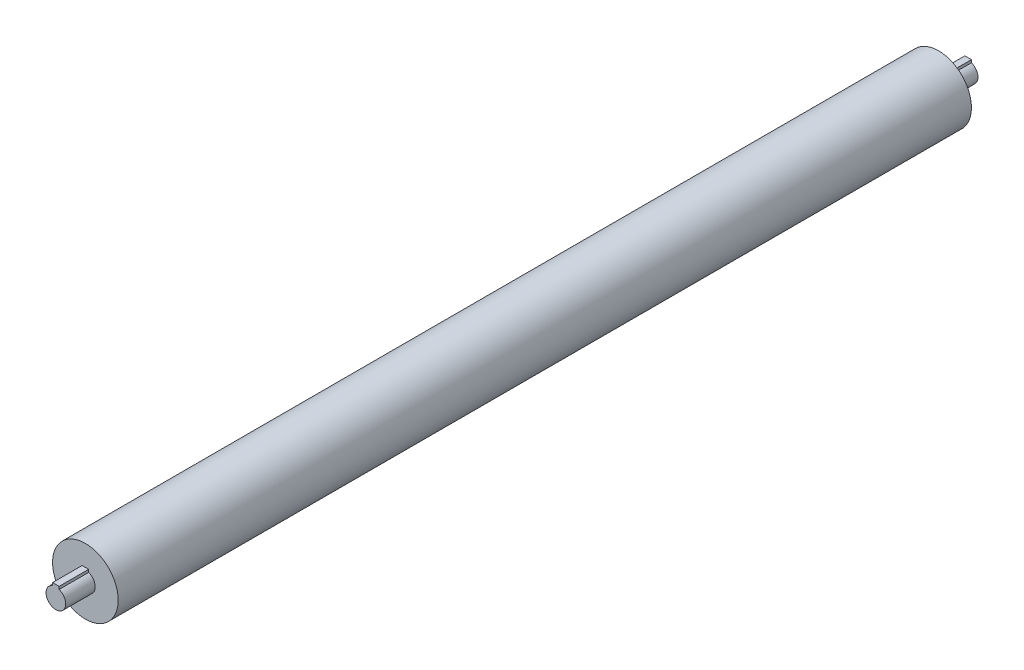
ISO-10303-21;
HEADER;
FILE_DESCRIPTION(('STEP AP214'),'2;1');
FILE_NAME('part.step','',(''),(''),'','','');
FILE_SCHEMA(('AUTOMOTIVE_DESIGN { 1 0 10303 214 1 1 1 1 }'));
ENDSEC;
DATA;
#1=APPLICATION_CONTEXT('core data for automotive mechanical design processes');
#2=APPLICATION_PROTOCOL_DEFINITION('international standard','automotive_design',2000,#1);
#3=PRODUCT_CONTEXT('',#1,'mechanical');
#4=PRODUCT('Part','Part','',(#3));
#5=PRODUCT_RELATED_PRODUCT_CATEGORY('part','',(#4));
#6=PRODUCT_DEFINITION_FORMATION('','',#4);
#7=PRODUCT_DEFINITION_CONTEXT('part definition',#1,'design');
#8=PRODUCT_DEFINITION('design','',#6,#7);
#9=PRODUCT_DEFINITION_SHAPE('','',#8);
#10=(LENGTH_UNIT() NAMED_UNIT(*) SI_UNIT(.MILLI.,.METRE.));
#11=(NAMED_UNIT(*) PLANE_ANGLE_UNIT() SI_UNIT($,.RADIAN.));
#12=(NAMED_UNIT(*) SI_UNIT($,.STERADIAN.) SOLID_ANGLE_UNIT());
#13=UNCERTAINTY_MEASURE_WITH_UNIT(LENGTH_MEASURE(1.E-05),#10,'distance_accuracy_value','');
#14=(GEOMETRIC_REPRESENTATION_CONTEXT(3) GLOBAL_UNCERTAINTY_ASSIGNED_CONTEXT((#13)) GLOBAL_UNIT_ASSIGNED_CONTEXT((#10,
#11,#12)) REPRESENTATION_CONTEXT('',''));
#15=CARTESIAN_POINT('',(0.,0.,0.));
#16=DIRECTION('',(0.,0.,1.));
#17=DIRECTION('',(1.,0.,0.));
#18=AXIS2_PLACEMENT_3D('',#15,#16,#17);
#19=CARTESIAN_POINT('',(0.,0.,650.));
#20=DIRECTION('',(0.,0.,-1.));
#21=DIRECTION('',(-1.,0.,0.));
#22=AXIS2_PLACEMENT_3D('',#19,#20,#21);
#23=CYLINDRICAL_SURFACE('',#22,50.);
#24=CARTESIAN_POINT('',(0.,0.,650.));
#25=DIRECTION('',(0.,0.,1.));
#26=DIRECTION('',(1.,0.,0.));
#27=AXIS2_PLACEMENT_3D('',#24,#25,#26);
#28=CIRCLE('',#27,50.);
#29=CARTESIAN_POINT('',(50.,0.,650.));
#30=VERTEX_POINT('',#29);
#31=EDGE_CURVE('E155',#30,#30,#28,.T.);
#32=ORIENTED_EDGE('',*,*,#31,.F.);
#33=EDGE_LOOP('',(#32));
#34=FACE_BOUND('',#33,.T.);
#35=CARTESIAN_POINT('',(0.,0.,-650.));
#36=DIRECTION('',(0.,0.,1.));
#37=DIRECTION('',(1.,0.,0.));
#38=AXIS2_PLACEMENT_3D('',#35,#36,#37);
#39=CIRCLE('',#38,50.);
#40=CARTESIAN_POINT('',(50.,0.,-650.));
#41=VERTEX_POINT('',#40);
#42=EDGE_CURVE('E154',#41,#41,#39,.T.);
#43=ORIENTED_EDGE('',*,*,#42,.T.);
#44=EDGE_LOOP('',(#43));
#45=FACE_BOUND('',#44,.T.);
#46=ADVANCED_FACE('F37',(#34,#45),#23,.T.);
#47=CARTESIAN_POINT('',(0.,0.,650.));
#48=DIRECTION('',(0.,0.,1.));
#49=DIRECTION('',(1.,0.,0.));
#50=AXIS2_PLACEMENT_3D('',#47,#48,#49);
#51=PLANE('',#50);
#52=DIRECTION('',(0.,-1.,0.));
#53=VECTOR('',#52,1.);
#54=CARTESIAN_POINT('',(-5.,0.,650.));
#55=LINE('',#54,#53);
#56=CARTESIAN_POINT('',(-5.,18.3,650.));
#57=VERTEX_POINT('',#56);
#58=CARTESIAN_POINT('',(-5.,14.1421356237309,650.));
#59=VERTEX_POINT('',#58);
#60=EDGE_CURVE('E106',#57,#59,#55,.T.);
#61=ORIENTED_EDGE('',*,*,#60,.F.);
#62=DIRECTION('',(-1.,0.,0.));
#63=VECTOR('',#62,1.);
#64=CARTESIAN_POINT('',(0.,18.3,650.));
#65=LINE('',#64,#63);
#66=CARTESIAN_POINT('',(5.,18.3,650.));
#67=VERTEX_POINT('',#66);
#68=EDGE_CURVE('E108',#67,#57,#65,.T.);
#69=ORIENTED_EDGE('',*,*,#68,.F.);
#70=DIRECTION('',(0.,1.,0.));
#71=VECTOR('',#70,1.);
#72=CARTESIAN_POINT('',(5.,0.,650.));
#73=LINE('',#72,#71);
#74=CARTESIAN_POINT('',(5.,14.1421356237309,650.));
#75=VERTEX_POINT('',#74);
#76=EDGE_CURVE('E56',#75,#67,#73,.T.);
#77=ORIENTED_EDGE('',*,*,#76,.F.);
#78=CARTESIAN_POINT('',(0.,0.,650.));
#79=DIRECTION('',(0.,0.,1.));
#80=DIRECTION('',(1.,0.,0.));
#81=AXIS2_PLACEMENT_3D('',#78,#79,#80);
#82=CIRCLE('',#81,15.);
#83=EDGE_CURVE('E51',#75,#59,#82,.F.);
#84=ORIENTED_EDGE('',*,*,#83,.T.);
#85=EDGE_LOOP('',(#61,#69,#77,#84));
#86=FACE_BOUND('',#85,.T.);
#87=ORIENTED_EDGE('',*,*,#31,.T.);
#88=EDGE_LOOP('',(#87));
#89=FACE_BOUND('',#88,.T.);
#90=ADVANCED_FACE('F195',(#86,#89),#51,.T.);
#91=CARTESIAN_POINT('',(0.,0.,-650.));
#92=DIRECTION('',(0.,0.,1.));
#93=DIRECTION('',(1.,0.,0.));
#94=AXIS2_PLACEMENT_3D('',#91,#92,#93);
#95=PLANE('',#94);
#96=DIRECTION('',(-1.,0.,0.));
#97=VECTOR('',#96,1.);
#98=CARTESIAN_POINT('',(0.,18.3,-650.));
#99=LINE('',#98,#97);
#100=CARTESIAN_POINT('',(5.,18.3,-650.));
#101=VERTEX_POINT('',#100);
#102=CARTESIAN_POINT('',(-5.,18.3,-650.));
#103=VERTEX_POINT('',#102);
#104=EDGE_CURVE('E158',#101,#103,#99,.T.);
#105=ORIENTED_EDGE('',*,*,#104,.T.);
#106=DIRECTION('',(0.,-1.,0.));
#107=VECTOR('',#106,1.);
#108=CARTESIAN_POINT('',(-5.,0.,-650.));
#109=LINE('',#108,#107);
#110=CARTESIAN_POINT('',(-5.,14.1421356237309,-650.));
#111=VERTEX_POINT('',#110);
#112=EDGE_CURVE('E11',#103,#111,#109,.T.);
#113=ORIENTED_EDGE('',*,*,#112,.T.);
#114=CARTESIAN_POINT('',(0.,0.,-650.));
#115=DIRECTION('',(0.,0.,1.));
#116=DIRECTION('',(1.,0.,0.));
#117=AXIS2_PLACEMENT_3D('',#114,#115,#116);
#118=CIRCLE('',#117,15.);
#119=CARTESIAN_POINT('',(5.,14.1421356237309,-650.));
#120=VERTEX_POINT('',#119);
#121=EDGE_CURVE('E44',#120,#111,#118,.F.);
#122=ORIENTED_EDGE('',*,*,#121,.F.);
#123=DIRECTION('',(0.,1.,0.));
#124=VECTOR('',#123,1.);
#125=CARTESIAN_POINT('',(5.,0.,-650.));
#126=LINE('',#125,#124);
#127=EDGE_CURVE('E163',#120,#101,#126,.T.);
#128=ORIENTED_EDGE('',*,*,#127,.T.);
#129=EDGE_LOOP('',(#105,#113,#122,#128));
#130=FACE_BOUND('',#129,.T.);
#131=ORIENTED_EDGE('',*,*,#42,.F.);
#132=EDGE_LOOP('',(#131));
#133=FACE_BOUND('',#132,.T.);
#134=ADVANCED_FACE('F176',(#130,#133),#95,.F.);
#135=CARTESIAN_POINT('',(0.,0.,-695.));
#136=DIRECTION('',(0.,0.,1.));
#137=DIRECTION('',(1.,0.,0.));
#138=AXIS2_PLACEMENT_3D('',#135,#136,#137);
#139=PLANE('',#138);
#140=DIRECTION('',(0.,1.,0.));
#141=VECTOR('',#140,1.);
#142=CARTESIAN_POINT('',(-5.,0.,-695.));
#143=LINE('',#142,#141);
#144=CARTESIAN_POINT('',(-5.,14.1421356237309,-695.));
#145=VERTEX_POINT('',#144);
#146=CARTESIAN_POINT('',(-5.,18.3,-695.));
#147=VERTEX_POINT('',#146);
#148=EDGE_CURVE('E133',#145,#147,#143,.T.);
#149=ORIENTED_EDGE('',*,*,#148,.T.);
#150=DIRECTION('',(1.,0.,0.));
#151=VECTOR('',#150,1.);
#152=CARTESIAN_POINT('',(0.,18.3,-695.));
#153=LINE('',#152,#151);
#154=CARTESIAN_POINT('',(5.,18.3,-695.));
#155=VERTEX_POINT('',#154);
#156=EDGE_CURVE('E124',#147,#155,#153,.T.);
#157=ORIENTED_EDGE('',*,*,#156,.T.);
#158=DIRECTION('',(0.,-1.,0.));
#159=VECTOR('',#158,1.);
#160=CARTESIAN_POINT('',(5.,0.,-695.));
#161=LINE('',#160,#159);
#162=CARTESIAN_POINT('',(5.,14.1421356237309,-695.));
#163=VERTEX_POINT('',#162);
#164=EDGE_CURVE('E127',#155,#163,#161,.T.);
#165=ORIENTED_EDGE('',*,*,#164,.T.);
#166=CARTESIAN_POINT('',(0.,0.,-695.));
#167=DIRECTION('',(0.,0.,1.));
#168=DIRECTION('',(1.,0.,0.));
#169=AXIS2_PLACEMENT_3D('',#166,#167,#168);
#170=CIRCLE('',#169,15.);
#171=EDGE_CURVE('E136',#145,#163,#170,.T.);
#172=ORIENTED_EDGE('',*,*,#171,.F.);
#173=EDGE_LOOP('',(#149,#157,#165,#172));
#174=FACE_BOUND('',#173,.T.);
#175=ADVANCED_FACE('F186',(#174),#139,.F.);
#176=CARTESIAN_POINT('',(0.,18.3,695.));
#177=DIRECTION('',(0.,1.,0.));
#178=DIRECTION('',(0.,0.,1.));
#179=AXIS2_PLACEMENT_3D('',#176,#177,#178);
#180=PLANE('',#179);
#181=ORIENTED_EDGE('',*,*,#104,.F.);
#182=DIRECTION('',(0.,0.,-1.));
#183=VECTOR('',#182,1.);
#184=CARTESIAN_POINT('',(5.,18.3,695.));
#185=LINE('',#184,#183);
#186=EDGE_CURVE('E143',#101,#155,#185,.T.);
#187=ORIENTED_EDGE('',*,*,#186,.T.);
#188=ORIENTED_EDGE('',*,*,#156,.F.);
#189=DIRECTION('',(0.,0.,-1.));
#190=VECTOR('',#189,1.);
#191=CARTESIAN_POINT('',(-5.,18.3,695.));
#192=LINE('',#191,#190);
#193=EDGE_CURVE('E132',#103,#147,#192,.T.);
#194=ORIENTED_EDGE('',*,*,#193,.F.);
#195=EDGE_LOOP('',(#181,#187,#188,#194));
#196=FACE_BOUND('',#195,.T.);
#197=ADVANCED_FACE('F180',(#196),#180,.T.);
#198=CARTESIAN_POINT('',(5.,0.,695.));
#199=DIRECTION('',(1.,0.,0.));
#200=DIRECTION('',(0.,0.,-1.));
#201=AXIS2_PLACEMENT_3D('',#198,#199,#200);
#202=PLANE('',#201);
#203=ORIENTED_EDGE('',*,*,#127,.F.);
#204=DIRECTION('',(0.,0.,-1.));
#205=VECTOR('',#204,1.);
#206=CARTESIAN_POINT('',(5.,14.1421356237309,695.));
#207=LINE('',#206,#205);
#208=EDGE_CURVE('E147',#120,#163,#207,.T.);
#209=ORIENTED_EDGE('',*,*,#208,.T.);
#210=ORIENTED_EDGE('',*,*,#164,.F.);
#211=ORIENTED_EDGE('',*,*,#186,.F.);
#212=EDGE_LOOP('',(#203,#209,#210,#211));
#213=FACE_BOUND('',#212,.T.);
#214=ADVANCED_FACE('F184',(#213),#202,.T.);
#215=CARTESIAN_POINT('',(0.,0.,695.));
#216=DIRECTION('',(0.,0.,-1.));
#217=DIRECTION('',(-1.,0.,0.));
#218=AXIS2_PLACEMENT_3D('',#215,#216,#217);
#219=CYLINDRICAL_SURFACE('',#218,15.);
#220=ORIENTED_EDGE('',*,*,#208,.F.);
#221=ORIENTED_EDGE('',*,*,#121,.T.);
#222=DIRECTION('',(0.,0.,-1.));
#223=VECTOR('',#222,1.);
#224=CARTESIAN_POINT('',(-5.,14.1421356237309,695.));
#225=LINE('',#224,#223);
#226=EDGE_CURVE('E109',#111,#145,#225,.T.);
#227=ORIENTED_EDGE('',*,*,#226,.T.);
#228=ORIENTED_EDGE('',*,*,#171,.T.);
#229=EDGE_LOOP('',(#220,#221,#227,#228));
#230=FACE_BOUND('',#229,.T.);
#231=ADVANCED_FACE('F169',(#230),#219,.T.);
#232=CARTESIAN_POINT('',(-5.,0.,695.));
#233=DIRECTION('',(-1.,0.,0.));
#234=DIRECTION('',(0.,0.,1.));
#235=AXIS2_PLACEMENT_3D('',#232,#233,#234);
#236=PLANE('',#235);
#237=ORIENTED_EDGE('',*,*,#112,.F.);
#238=ORIENTED_EDGE('',*,*,#193,.T.);
#239=ORIENTED_EDGE('',*,*,#148,.F.);
#240=ORIENTED_EDGE('',*,*,#226,.F.);
#241=EDGE_LOOP('',(#237,#238,#239,#240));
#242=FACE_BOUND('',#241,.T.);
#243=ADVANCED_FACE('F175',(#242),#236,.T.);
#244=CARTESIAN_POINT('',(-5.,18.3,695.));
#245=VERTEX_POINT('',#244);
#246=EDGE_CURVE('E141',#245,#57,#192,.T.);
#247=ORIENTED_EDGE('',*,*,#246,.T.);
#248=ORIENTED_EDGE('',*,*,#60,.T.);
#249=CARTESIAN_POINT('',(-5.,14.1421356237309,695.));
#250=VERTEX_POINT('',#249);
#251=EDGE_CURVE('E99',#250,#59,#225,.T.);
#252=ORIENTED_EDGE('',*,*,#251,.F.);
#253=DIRECTION('',(0.,1.,0.));
#254=VECTOR('',#253,1.);
#255=CARTESIAN_POINT('',(-5.,0.,695.));
#256=LINE('',#255,#254);
#257=EDGE_CURVE('E104',#250,#245,#256,.T.);
#258=ORIENTED_EDGE('',*,*,#257,.T.);
#259=EDGE_LOOP('',(#247,#248,#252,#258));
#260=FACE_BOUND('',#259,.T.);
#261=ADVANCED_FACE('F102',(#260),#236,.T.);
#262=ORIENTED_EDGE('',*,*,#83,.F.);
#263=CARTESIAN_POINT('',(5.,14.1421356237309,695.));
#264=VERTEX_POINT('',#263);
#265=EDGE_CURVE('E115',#264,#75,#207,.T.);
#266=ORIENTED_EDGE('',*,*,#265,.F.);
#267=CARTESIAN_POINT('',(0.,0.,695.));
#268=DIRECTION('',(0.,0.,1.));
#269=DIRECTION('',(1.,0.,0.));
#270=AXIS2_PLACEMENT_3D('',#267,#268,#269);
#271=CIRCLE('',#270,15.);
#272=EDGE_CURVE('E112',#250,#264,#271,.T.);
#273=ORIENTED_EDGE('',*,*,#272,.F.);
#274=ORIENTED_EDGE('',*,*,#251,.T.);
#275=EDGE_LOOP('',(#262,#266,#273,#274));
#276=FACE_BOUND('',#275,.T.);
#277=ADVANCED_FACE('F113',(#276),#219,.T.);
#278=ORIENTED_EDGE('',*,*,#265,.T.);
#279=ORIENTED_EDGE('',*,*,#76,.T.);
#280=CARTESIAN_POINT('',(5.,18.3,695.));
#281=VERTEX_POINT('',#280);
#282=EDGE_CURVE('E144',#281,#67,#185,.T.);
#283=ORIENTED_EDGE('',*,*,#282,.F.);
#284=DIRECTION('',(0.,-1.,0.));
#285=VECTOR('',#284,1.);
#286=CARTESIAN_POINT('',(5.,0.,695.));
#287=LINE('',#286,#285);
#288=EDGE_CURVE('E119',#281,#264,#287,.T.);
#289=ORIENTED_EDGE('',*,*,#288,.T.);
#290=EDGE_LOOP('',(#278,#279,#283,#289));
#291=FACE_BOUND('',#290,.T.);
#292=ADVANCED_FACE('F214',(#291),#202,.T.);
#293=ORIENTED_EDGE('',*,*,#282,.T.);
#294=ORIENTED_EDGE('',*,*,#68,.T.);
#295=ORIENTED_EDGE('',*,*,#246,.F.);
#296=DIRECTION('',(1.,0.,0.));
#297=VECTOR('',#296,1.);
#298=CARTESIAN_POINT('',(0.,18.3,695.));
#299=LINE('',#298,#297);
#300=EDGE_CURVE('E123',#245,#281,#299,.T.);
#301=ORIENTED_EDGE('',*,*,#300,.T.);
#302=EDGE_LOOP('',(#293,#294,#295,#301));
#303=FACE_BOUND('',#302,.T.);
#304=ADVANCED_FACE('F194',(#303),#180,.T.);
#305=CARTESIAN_POINT('',(0.,0.,695.));
#306=DIRECTION('',(0.,0.,1.));
#307=DIRECTION('',(1.,0.,0.));
#308=AXIS2_PLACEMENT_3D('',#305,#306,#307);
#309=PLANE('',#308);
#310=ORIENTED_EDGE('',*,*,#257,.F.);
#311=ORIENTED_EDGE('',*,*,#272,.T.);
#312=ORIENTED_EDGE('',*,*,#288,.F.);
#313=ORIENTED_EDGE('',*,*,#300,.F.);
#314=EDGE_LOOP('',(#310,#311,#312,#313));
#315=FACE_BOUND('',#314,.T.);
#316=ADVANCED_FACE('F121',(#315),#309,.T.);
#317=CLOSED_SHELL('',(#46,#90,#134,#175,#197,#214,#231,#243,#261,#277,#292,#304,#316));
#318=MANIFOLD_SOLID_BREP('B2',#317);
#319=ADVANCED_BREP_SHAPE_REPRESENTATION('',(#18,#318),#14);
#320=SHAPE_DEFINITION_REPRESENTATION(#9,#319);
ENDSEC;
END-ISO-10303-21;
